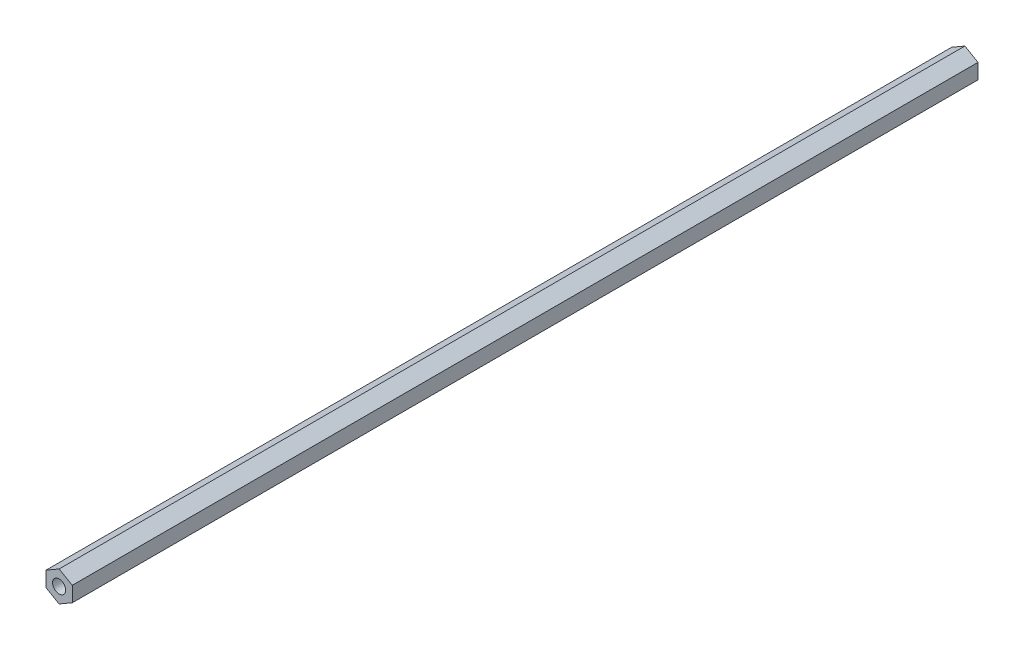
ISO-10303-21;
HEADER;
FILE_DESCRIPTION(('STEP AP214'),'2;1');
FILE_NAME('part.step','',(''),(''),'','','');
FILE_SCHEMA(('AUTOMOTIVE_DESIGN { 1 0 10303 214 1 1 1 1 }'));
ENDSEC;
DATA;
#1=APPLICATION_CONTEXT('core data for automotive mechanical design processes');
#2=APPLICATION_PROTOCOL_DEFINITION('international standard','automotive_design',2000,#1);
#3=PRODUCT_CONTEXT('',#1,'mechanical');
#4=PRODUCT('Part','Part','',(#3));
#5=PRODUCT_RELATED_PRODUCT_CATEGORY('part','',(#4));
#6=PRODUCT_DEFINITION_FORMATION('','',#4);
#7=PRODUCT_DEFINITION_CONTEXT('part definition',#1,'design');
#8=PRODUCT_DEFINITION('design','',#6,#7);
#9=PRODUCT_DEFINITION_SHAPE('','',#8);
#10=(LENGTH_UNIT() NAMED_UNIT(*) SI_UNIT(.MILLI.,.METRE.));
#11=(NAMED_UNIT(*) PLANE_ANGLE_UNIT() SI_UNIT($,.RADIAN.));
#12=(NAMED_UNIT(*) SI_UNIT($,.STERADIAN.) SOLID_ANGLE_UNIT());
#13=UNCERTAINTY_MEASURE_WITH_UNIT(LENGTH_MEASURE(1.E-05),#10,'distance_accuracy_value','');
#14=(GEOMETRIC_REPRESENTATION_CONTEXT(3) GLOBAL_UNCERTAINTY_ASSIGNED_CONTEXT((#13)) GLOBAL_UNIT_ASSIGNED_CONTEXT((#10,
#11,#12)) REPRESENTATION_CONTEXT('',''));
#15=CARTESIAN_POINT('',(0.,0.,0.));
#16=DIRECTION('',(0.,0.,1.));
#17=DIRECTION('',(1.,0.,0.));
#18=AXIS2_PLACEMENT_3D('',#15,#16,#17);
#19=CARTESIAN_POINT('',(-6.35,3.66617420935411,219.075000508));
#20=DIRECTION('',(1.,0.,0.));
#21=DIRECTION('',(0.,0.,-1.));
#22=AXIS2_PLACEMENT_3D('',#19,#20,#21);
#23=PLANE('',#22);
#24=DIRECTION('',(0.,0.,-1.));
#25=VECTOR('',#24,1.);
#26=CARTESIAN_POINT('',(-6.35,3.66617420935411,219.075000508));
#27=LINE('',#26,#25);
#28=CARTESIAN_POINT('',(-6.35,3.66617420935411,219.075000508));
#29=VERTEX_POINT('',#28);
#30=CARTESIAN_POINT('',(-6.35,3.66617420935411,-219.075000508));
#31=VERTEX_POINT('',#30);
#32=EDGE_CURVE('E141',#29,#31,#27,.T.);
#33=ORIENTED_EDGE('',*,*,#32,.T.);
#34=DIRECTION('',(0.,-1.,0.));
#35=VECTOR('',#34,1.);
#36=CARTESIAN_POINT('',(-6.35,3.66617420935411,-219.075000508));
#37=LINE('',#36,#35);
#38=CARTESIAN_POINT('',(-6.35,-3.66617420935413,-219.075000508));
#39=VERTEX_POINT('',#38);
#40=EDGE_CURVE('E113',#31,#39,#37,.T.);
#41=ORIENTED_EDGE('',*,*,#40,.T.);
#42=DIRECTION('',(0.,0.,-1.));
#43=VECTOR('',#42,1.);
#44=CARTESIAN_POINT('',(-6.35,-3.66617420935413,219.075000508));
#45=LINE('',#44,#43);
#46=CARTESIAN_POINT('',(-6.35,-3.66617420935413,219.075000508));
#47=VERTEX_POINT('',#46);
#48=EDGE_CURVE('E11',#47,#39,#45,.T.);
#49=ORIENTED_EDGE('',*,*,#48,.F.);
#50=DIRECTION('',(0.,-1.,0.));
#51=VECTOR('',#50,1.);
#52=CARTESIAN_POINT('',(-6.35,3.66617420935411,219.075000508));
#53=LINE('',#52,#51);
#54=EDGE_CURVE('E131',#29,#47,#53,.T.);
#55=ORIENTED_EDGE('',*,*,#54,.F.);
#56=EDGE_LOOP('',(#33,#41,#49,#55));
#57=FACE_BOUND('',#56,.T.);
#58=ADVANCED_FACE('F37',(#57),#23,.F.);
#59=CARTESIAN_POINT('',(-6.35,-3.66617420935413,219.075000508));
#60=DIRECTION('',(0.5,0.866025403784438,0.));
#61=DIRECTION('',(-0.866025403784439,0.5,0.));
#62=AXIS2_PLACEMENT_3D('',#59,#60,#61);
#63=PLANE('',#62);
#64=ORIENTED_EDGE('',*,*,#48,.T.);
#65=DIRECTION('',(0.866025403784439,-0.5,0.));
#66=VECTOR('',#65,1.);
#67=CARTESIAN_POINT('',(-6.35,-3.66617420935413,-219.075000508));
#68=LINE('',#67,#66);
#69=CARTESIAN_POINT('',(0.,-7.33234841870826,-219.075000508));
#70=VERTEX_POINT('',#69);
#71=EDGE_CURVE('E116',#39,#70,#68,.T.);
#72=ORIENTED_EDGE('',*,*,#71,.T.);
#73=DIRECTION('',(0.,0.,-1.));
#74=VECTOR('',#73,1.);
#75=CARTESIAN_POINT('',(0.,-7.33234841870826,219.075000508));
#76=LINE('',#75,#74);
#77=CARTESIAN_POINT('',(0.,-7.33234841870826,219.075000508));
#78=VERTEX_POINT('',#77);
#79=EDGE_CURVE('E44',#78,#70,#76,.T.);
#80=ORIENTED_EDGE('',*,*,#79,.F.);
#81=DIRECTION('',(0.866025403784439,-0.5,0.));
#82=VECTOR('',#81,1.);
#83=CARTESIAN_POINT('',(-6.35,-3.66617420935413,219.075000508));
#84=LINE('',#83,#82);
#85=EDGE_CURVE('E133',#47,#78,#84,.T.);
#86=ORIENTED_EDGE('',*,*,#85,.F.);
#87=EDGE_LOOP('',(#64,#72,#80,#86));
#88=FACE_BOUND('',#87,.T.);
#89=ADVANCED_FACE('F161',(#88),#63,.F.);
#90=CARTESIAN_POINT('',(0.,-7.33234841870826,219.075000508));
#91=DIRECTION('',(-0.5,0.866025403784439,0.));
#92=DIRECTION('',(-0.866025403784439,-0.5,0.));
#93=AXIS2_PLACEMENT_3D('',#90,#91,#92);
#94=PLANE('',#93);
#95=ORIENTED_EDGE('',*,*,#79,.T.);
#96=DIRECTION('',(0.866025403784439,0.5,0.));
#97=VECTOR('',#96,1.);
#98=CARTESIAN_POINT('',(0.,-7.33234841870826,-219.075000508));
#99=LINE('',#98,#97);
#100=CARTESIAN_POINT('',(6.35,-3.66617420935414,-219.075000508));
#101=VERTEX_POINT('',#100);
#102=EDGE_CURVE('E119',#70,#101,#99,.T.);
#103=ORIENTED_EDGE('',*,*,#102,.T.);
#104=DIRECTION('',(0.,0.,-1.));
#105=VECTOR('',#104,1.);
#106=CARTESIAN_POINT('',(6.35,-3.66617420935414,219.075000508));
#107=LINE('',#106,#105);
#108=CARTESIAN_POINT('',(6.35,-3.66617420935414,219.075000508));
#109=VERTEX_POINT('',#108);
#110=EDGE_CURVE('E147',#109,#101,#107,.T.);
#111=ORIENTED_EDGE('',*,*,#110,.F.);
#112=DIRECTION('',(0.866025403784439,0.5,0.));
#113=VECTOR('',#112,1.);
#114=CARTESIAN_POINT('',(0.,-7.33234841870826,219.075000508));
#115=LINE('',#114,#113);
#116=EDGE_CURVE('E135',#78,#109,#115,.T.);
#117=ORIENTED_EDGE('',*,*,#116,.F.);
#118=EDGE_LOOP('',(#95,#103,#111,#117));
#119=FACE_BOUND('',#118,.T.);
#120=ADVANCED_FACE('F152',(#119),#94,.F.);
#121=CARTESIAN_POINT('',(6.35,-3.66617420935414,219.075000508));
#122=DIRECTION('',(-1.,0.,0.));
#123=DIRECTION('',(0.,-1.,0.));
#124=AXIS2_PLACEMENT_3D('',#121,#122,#123);
#125=PLANE('',#124);
#126=ORIENTED_EDGE('',*,*,#110,.T.);
#127=DIRECTION('',(0.,1.,0.));
#128=VECTOR('',#127,1.);
#129=CARTESIAN_POINT('',(6.35,-3.66617420935414,-219.075000508));
#130=LINE('',#129,#128);
#131=CARTESIAN_POINT('',(6.35,3.66617420935412,-219.075000508));
#132=VERTEX_POINT('',#131);
#133=EDGE_CURVE('E122',#101,#132,#130,.T.);
#134=ORIENTED_EDGE('',*,*,#133,.T.);
#135=DIRECTION('',(0.,0.,-1.));
#136=VECTOR('',#135,1.);
#137=CARTESIAN_POINT('',(6.35,3.66617420935412,219.075000508));
#138=LINE('',#137,#136);
#139=CARTESIAN_POINT('',(6.35,3.66617420935412,219.075000508));
#140=VERTEX_POINT('',#139);
#141=EDGE_CURVE('E145',#140,#132,#138,.T.);
#142=ORIENTED_EDGE('',*,*,#141,.F.);
#143=DIRECTION('',(0.,1.,0.));
#144=VECTOR('',#143,1.);
#145=CARTESIAN_POINT('',(6.35,-3.66617420935414,219.075000508));
#146=LINE('',#145,#144);
#147=EDGE_CURVE('E137',#109,#140,#146,.T.);
#148=ORIENTED_EDGE('',*,*,#147,.F.);
#149=EDGE_LOOP('',(#126,#134,#142,#148));
#150=FACE_BOUND('',#149,.T.);
#151=ADVANCED_FACE('F172',(#150),#125,.F.);
#152=CARTESIAN_POINT('',(6.35,3.66617420935412,219.075000508));
#153=DIRECTION('',(-0.5,-0.866025403784439,0.));
#154=DIRECTION('',(0.866025403784439,-0.5,0.));
#155=AXIS2_PLACEMENT_3D('',#152,#153,#154);
#156=PLANE('',#155);
#157=ORIENTED_EDGE('',*,*,#141,.T.);
#158=DIRECTION('',(-0.866025403784439,0.5,0.));
#159=VECTOR('',#158,1.);
#160=CARTESIAN_POINT('',(6.35,3.66617420935412,-219.075000508));
#161=LINE('',#160,#159);
#162=CARTESIAN_POINT('',(0.,7.33234841870824,-219.075000508));
#163=VERTEX_POINT('',#162);
#164=EDGE_CURVE('E125',#132,#163,#161,.T.);
#165=ORIENTED_EDGE('',*,*,#164,.T.);
#166=DIRECTION('',(0.,0.,-1.));
#167=VECTOR('',#166,1.);
#168=CARTESIAN_POINT('',(0.,7.33234841870824,219.075000508));
#169=LINE('',#168,#167);
#170=CARTESIAN_POINT('',(0.,7.33234841870824,219.075000508));
#171=VERTEX_POINT('',#170);
#172=EDGE_CURVE('E143',#171,#163,#169,.T.);
#173=ORIENTED_EDGE('',*,*,#172,.F.);
#174=DIRECTION('',(-0.866025403784439,0.5,0.));
#175=VECTOR('',#174,1.);
#176=CARTESIAN_POINT('',(6.35,3.66617420935412,219.075000508));
#177=LINE('',#176,#175);
#178=EDGE_CURVE('E56',#140,#171,#177,.T.);
#179=ORIENTED_EDGE('',*,*,#178,.F.);
#180=EDGE_LOOP('',(#157,#165,#173,#179));
#181=FACE_BOUND('',#180,.T.);
#182=ADVANCED_FACE('F169',(#181),#156,.F.);
#183=CARTESIAN_POINT('',(0.,7.33234841870824,219.075000508));
#184=DIRECTION('',(0.5,-0.866025403784439,0.));
#185=DIRECTION('',(0.866025403784439,0.5,0.));
#186=AXIS2_PLACEMENT_3D('',#183,#184,#185);
#187=PLANE('',#186);
#188=ORIENTED_EDGE('',*,*,#172,.T.);
#189=DIRECTION('',(-0.866025403784439,-0.5,0.));
#190=VECTOR('',#189,1.);
#191=CARTESIAN_POINT('',(0.,7.33234841870824,-219.075000508));
#192=LINE('',#191,#190);
#193=EDGE_CURVE('E128',#163,#31,#192,.T.);
#194=ORIENTED_EDGE('',*,*,#193,.T.);
#195=ORIENTED_EDGE('',*,*,#32,.F.);
#196=DIRECTION('',(-0.866025403784439,-0.5,0.));
#197=VECTOR('',#196,1.);
#198=CARTESIAN_POINT('',(0.,7.33234841870824,219.075000508));
#199=LINE('',#198,#197);
#200=EDGE_CURVE('E51',#171,#29,#199,.T.);
#201=ORIENTED_EDGE('',*,*,#200,.F.);
#202=EDGE_LOOP('',(#188,#194,#195,#201));
#203=FACE_BOUND('',#202,.T.);
#204=ADVANCED_FACE('F167',(#203),#187,.F.);
#205=CARTESIAN_POINT('',(0.,0.,219.075000508));
#206=DIRECTION('',(0.,0.,1.));
#207=DIRECTION('',(1.,0.,0.));
#208=AXIS2_PLACEMENT_3D('',#205,#206,#207);
#209=PLANE('',#208);
#210=CARTESIAN_POINT('',(0.,0.,219.075000508));
#211=DIRECTION('',(0.,0.,1.));
#212=DIRECTION('',(1.,0.,0.));
#213=AXIS2_PLACEMENT_3D('',#210,#211,#212);
#214=CIRCLE('',#213,3.17499999999999);
#215=CARTESIAN_POINT('',(3.17499999999999,0.,219.075000508));
#216=VERTEX_POINT('',#215);
#217=EDGE_CURVE('E102',#216,#216,#214,.T.);
#218=ORIENTED_EDGE('',*,*,#217,.F.);
#219=EDGE_LOOP('',(#218));
#220=FACE_BOUND('',#219,.T.);
#221=ORIENTED_EDGE('',*,*,#54,.T.);
#222=ORIENTED_EDGE('',*,*,#85,.T.);
#223=ORIENTED_EDGE('',*,*,#116,.T.);
#224=ORIENTED_EDGE('',*,*,#147,.T.);
#225=ORIENTED_EDGE('',*,*,#178,.T.);
#226=ORIENTED_EDGE('',*,*,#200,.T.);
#227=EDGE_LOOP('',(#221,#222,#223,#224,#225,#226));
#228=FACE_BOUND('',#227,.T.);
#229=ADVANCED_FACE('F174',(#220,#228),#209,.T.);
#230=CARTESIAN_POINT('',(0.,0.,-219.075000508));
#231=DIRECTION('',(0.,0.,1.));
#232=DIRECTION('',(1.,0.,0.));
#233=AXIS2_PLACEMENT_3D('',#230,#231,#232);
#234=PLANE('',#233);
#235=CARTESIAN_POINT('',(0.,0.,-219.075000508));
#236=DIRECTION('',(0.,0.,-1.));
#237=DIRECTION('',(-1.,0.,0.));
#238=AXIS2_PLACEMENT_3D('',#235,#236,#237);
#239=CIRCLE('',#238,3.17499999999999);
#240=CARTESIAN_POINT('',(-3.17499999999999,0.,-219.075000508));
#241=VERTEX_POINT('',#240);
#242=EDGE_CURVE('E103',#241,#241,#239,.T.);
#243=ORIENTED_EDGE('',*,*,#242,.F.);
#244=EDGE_LOOP('',(#243));
#245=FACE_BOUND('',#244,.T.);
#246=ORIENTED_EDGE('',*,*,#40,.F.);
#247=ORIENTED_EDGE('',*,*,#193,.F.);
#248=ORIENTED_EDGE('',*,*,#164,.F.);
#249=ORIENTED_EDGE('',*,*,#133,.F.);
#250=ORIENTED_EDGE('',*,*,#102,.F.);
#251=ORIENTED_EDGE('',*,*,#71,.F.);
#252=EDGE_LOOP('',(#246,#247,#248,#249,#250,#251));
#253=FACE_BOUND('',#252,.T.);
#254=ADVANCED_FACE('F159',(#245,#253),#234,.F.);
#255=CARTESIAN_POINT('',(0.,0.,193.675000508));
#256=DIRECTION('',(0.,0.,1.));
#257=DIRECTION('',(1.,0.,0.));
#258=AXIS2_PLACEMENT_3D('',#255,#256,#257);
#259=CONICAL_SURFACE('',#258,3.17499999999995,1.02974425867665);
#260=CARTESIAN_POINT('',(0.,0.,191.767268042588));
#261=VERTEX_POINT('',#260);
#262=VERTEX_LOOP('',#261);
#263=FACE_BOUND('',#262,.T.);
#264=CARTESIAN_POINT('',(0.,0.,193.675000508));
#265=DIRECTION('',(0.,0.,1.));
#266=DIRECTION('',(1.,0.,0.));
#267=AXIS2_PLACEMENT_3D('',#264,#265,#266);
#268=CIRCLE('',#267,3.17499999999995);
#269=CARTESIAN_POINT('',(3.17499999999995,0.,193.675000508));
#270=VERTEX_POINT('',#269);
#271=EDGE_CURVE('E106',#270,#270,#268,.T.);
#272=ORIENTED_EDGE('',*,*,#271,.T.);
#273=EDGE_LOOP('',(#272));
#274=FACE_BOUND('',#273,.T.);
#275=ADVANCED_FACE('F182',(#263,#274),#259,.F.);
#276=CARTESIAN_POINT('',(0.,0.,219.075000508));
#277=DIRECTION('',(0.,0.,1.));
#278=DIRECTION('',(1.,0.,0.));
#279=AXIS2_PLACEMENT_3D('',#276,#277,#278);
#280=CYLINDRICAL_SURFACE('',#279,3.17499999999997);
#281=ORIENTED_EDGE('',*,*,#271,.F.);
#282=EDGE_LOOP('',(#281));
#283=FACE_BOUND('',#282,.T.);
#284=ORIENTED_EDGE('',*,*,#217,.T.);
#285=EDGE_LOOP('',(#284));
#286=FACE_BOUND('',#285,.T.);
#287=ADVANCED_FACE('F96',(#283,#286),#280,.F.);
#288=CARTESIAN_POINT('',(0.,0.,-193.675000508));
#289=DIRECTION('',(0.,0.,-1.));
#290=DIRECTION('',(-1.,0.,0.));
#291=AXIS2_PLACEMENT_3D('',#288,#289,#290);
#292=CONICAL_SURFACE('',#291,3.17499999999995,1.02974425867665);
#293=CARTESIAN_POINT('',(0.,0.,-191.767268042588));
#294=VERTEX_POINT('',#293);
#295=VERTEX_LOOP('',#294);
#296=FACE_BOUND('',#295,.T.);
#297=CARTESIAN_POINT('',(0.,0.,-193.675000508));
#298=DIRECTION('',(0.,0.,-1.));
#299=DIRECTION('',(-1.,0.,0.));
#300=AXIS2_PLACEMENT_3D('',#297,#298,#299);
#301=CIRCLE('',#300,3.17499999999995);
#302=CARTESIAN_POINT('',(-3.17499999999995,0.,-193.675000508));
#303=VERTEX_POINT('',#302);
#304=EDGE_CURVE('E100',#303,#303,#301,.T.);
#305=ORIENTED_EDGE('',*,*,#304,.T.);
#306=EDGE_LOOP('',(#305));
#307=FACE_BOUND('',#306,.T.);
#308=ADVANCED_FACE('F92',(#296,#307),#292,.F.);
#309=CARTESIAN_POINT('',(0.,0.,-219.075000508));
#310=DIRECTION('',(0.,0.,-1.));
#311=DIRECTION('',(-1.,0.,0.));
#312=AXIS2_PLACEMENT_3D('',#309,#310,#311);
#313=CYLINDRICAL_SURFACE('',#312,3.17499999999997);
#314=ORIENTED_EDGE('',*,*,#304,.F.);
#315=EDGE_LOOP('',(#314));
#316=FACE_BOUND('',#315,.T.);
#317=ORIENTED_EDGE('',*,*,#242,.T.);
#318=EDGE_LOOP('',(#317));
#319=FACE_BOUND('',#318,.T.);
#320=ADVANCED_FACE('F95',(#316,#319),#313,.F.);
#321=CLOSED_SHELL('',(#58,#89,#120,#151,#182,#204,#229,#254,#275,#287,#308,#320));
#322=MANIFOLD_SOLID_BREP('B2',#321);
#323=ADVANCED_BREP_SHAPE_REPRESENTATION('',(#18,#322),#14);
#324=SHAPE_DEFINITION_REPRESENTATION(#9,#323);
ENDSEC;
END-ISO-10303-21;
